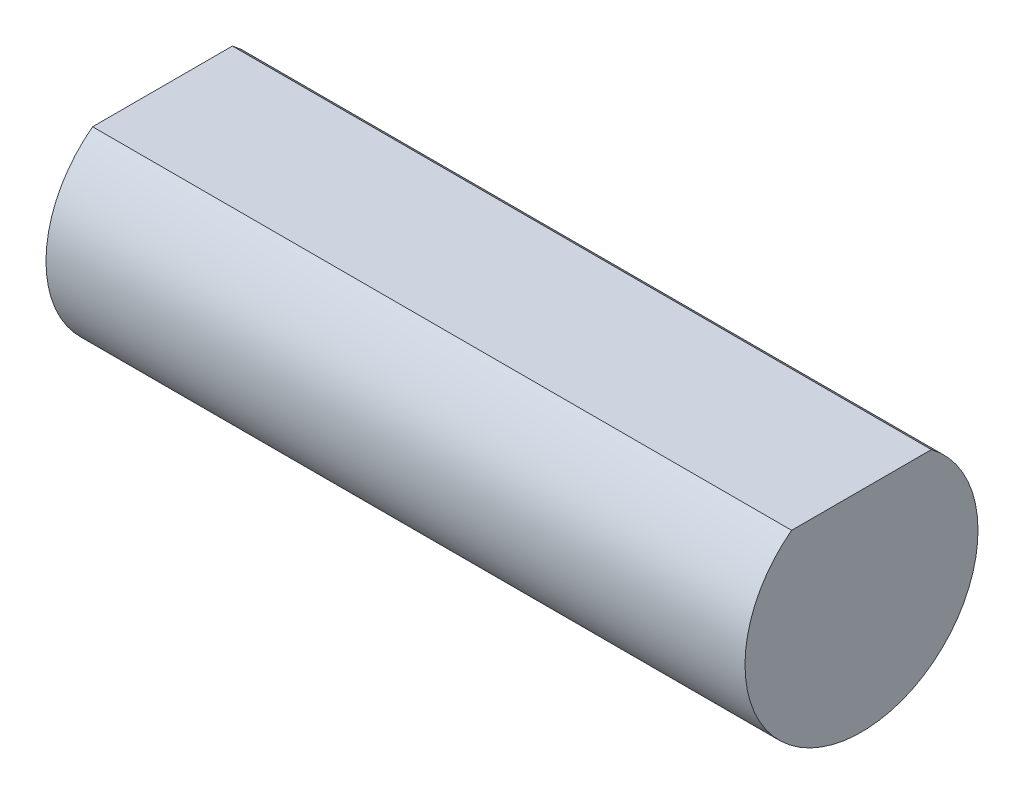
ISO-10303-21;
HEADER;
FILE_DESCRIPTION(('STEP AP214'),'2;1');
FILE_NAME('part.step','',(''),(''),'','','');
FILE_SCHEMA(('AUTOMOTIVE_DESIGN { 1 0 10303 214 1 1 1 1 }'));
ENDSEC;
DATA;
#1=APPLICATION_CONTEXT('core data for automotive mechanical design processes');
#2=APPLICATION_PROTOCOL_DEFINITION('international standard','automotive_design',2000,#1);
#3=PRODUCT_CONTEXT('',#1,'mechanical');
#4=PRODUCT('Part','Part','',(#3));
#5=PRODUCT_RELATED_PRODUCT_CATEGORY('part','',(#4));
#6=PRODUCT_DEFINITION_FORMATION('','',#4);
#7=PRODUCT_DEFINITION_CONTEXT('part definition',#1,'design');
#8=PRODUCT_DEFINITION('design','',#6,#7);
#9=PRODUCT_DEFINITION_SHAPE('','',#8);
#10=(LENGTH_UNIT() NAMED_UNIT(*) SI_UNIT(.MILLI.,.METRE.));
#11=(NAMED_UNIT(*) PLANE_ANGLE_UNIT() SI_UNIT($,.RADIAN.));
#12=(NAMED_UNIT(*) SI_UNIT($,.STERADIAN.) SOLID_ANGLE_UNIT());
#13=UNCERTAINTY_MEASURE_WITH_UNIT(LENGTH_MEASURE(1.E-05),#10,'distance_accuracy_value','');
#14=(GEOMETRIC_REPRESENTATION_CONTEXT(3) GLOBAL_UNCERTAINTY_ASSIGNED_CONTEXT((#13)) GLOBAL_UNIT_ASSIGNED_CONTEXT((#10,
#11,#12)) REPRESENTATION_CONTEXT('',''));
#15=CARTESIAN_POINT('',(0.,0.,0.));
#16=DIRECTION('',(0.,0.,1.));
#17=DIRECTION('',(1.,0.,0.));
#18=AXIS2_PLACEMENT_3D('',#15,#16,#17);
#19=CARTESIAN_POINT('',(19.05,2.54,0.));
#20=DIRECTION('',(0.,1.,0.));
#21=DIRECTION('',(0.,0.,1.));
#22=AXIS2_PLACEMENT_3D('',#19,#20,#21);
#23=PLANE('',#22);
#24=DIRECTION('',(0.,0.,-1.));
#25=VECTOR('',#24,1.);
#26=CARTESIAN_POINT('',(0.,2.54,0.));
#27=LINE('',#26,#25);
#28=CARTESIAN_POINT('',(0.,2.54,1.905));
#29=VERTEX_POINT('',#28);
#30=CARTESIAN_POINT('',(0.,2.54,-1.905));
#31=VERTEX_POINT('',#30);
#32=EDGE_CURVE('E61',#29,#31,#27,.T.);
#33=ORIENTED_EDGE('',*,*,#32,.F.);
#34=DIRECTION('',(-1.,0.,0.));
#35=VECTOR('',#34,1.);
#36=CARTESIAN_POINT('',(19.05,2.54,1.905));
#37=LINE('',#36,#35);
#38=CARTESIAN_POINT('',(19.05,2.54,1.905));
#39=VERTEX_POINT('',#38);
#40=EDGE_CURVE('E11',#39,#29,#37,.T.);
#41=ORIENTED_EDGE('',*,*,#40,.F.);
#42=DIRECTION('',(0.,0.,-1.));
#43=VECTOR('',#42,1.);
#44=CARTESIAN_POINT('',(19.05,2.54,0.));
#45=LINE('',#44,#43);
#46=CARTESIAN_POINT('',(19.05,2.54,-1.905));
#47=VERTEX_POINT('',#46);
#48=EDGE_CURVE('E62',#39,#47,#45,.T.);
#49=ORIENTED_EDGE('',*,*,#48,.T.);
#50=DIRECTION('',(-1.,0.,0.));
#51=VECTOR('',#50,1.);
#52=CARTESIAN_POINT('',(19.05,2.54,-1.905));
#53=LINE('',#52,#51);
#54=EDGE_CURVE('E41',#47,#31,#53,.T.);
#55=ORIENTED_EDGE('',*,*,#54,.T.);
#56=EDGE_LOOP('',(#33,#41,#49,#55));
#57=FACE_BOUND('',#56,.T.);
#58=ADVANCED_FACE('F33',(#57),#23,.T.);
#59=CARTESIAN_POINT('',(19.05,0.,0.));
#60=DIRECTION('',(-1.,0.,0.));
#61=DIRECTION('',(0.,0.,1.));
#62=AXIS2_PLACEMENT_3D('',#59,#60,#61);
#63=CYLINDRICAL_SURFACE('',#62,3.175);
#64=CARTESIAN_POINT('',(0.,0.,0.));
#65=DIRECTION('',(1.,0.,0.));
#66=DIRECTION('',(0.,0.,-1.));
#67=AXIS2_PLACEMENT_3D('',#64,#65,#66);
#68=CIRCLE('',#67,3.175);
#69=EDGE_CURVE('E63',#29,#31,#68,.T.);
#70=ORIENTED_EDGE('',*,*,#69,.T.);
#71=ORIENTED_EDGE('',*,*,#54,.F.);
#72=CARTESIAN_POINT('',(19.05,0.,0.));
#73=DIRECTION('',(1.,0.,0.));
#74=DIRECTION('',(0.,0.,-1.));
#75=AXIS2_PLACEMENT_3D('',#72,#73,#74);
#76=CIRCLE('',#75,3.175);
#77=EDGE_CURVE('E48',#39,#47,#76,.T.);
#78=ORIENTED_EDGE('',*,*,#77,.F.);
#79=ORIENTED_EDGE('',*,*,#40,.T.);
#80=EDGE_LOOP('',(#70,#71,#78,#79));
#81=FACE_BOUND('',#80,.T.);
#82=ADVANCED_FACE('F64',(#81),#63,.T.);
#83=CARTESIAN_POINT('',(19.05,0.,0.));
#84=DIRECTION('',(1.,0.,0.));
#85=DIRECTION('',(0.,0.,-1.));
#86=AXIS2_PLACEMENT_3D('',#83,#84,#85);
#87=PLANE('',#86);
#88=ORIENTED_EDGE('',*,*,#48,.F.);
#89=ORIENTED_EDGE('',*,*,#77,.T.);
#90=EDGE_LOOP('',(#88,#89));
#91=FACE_BOUND('',#90,.T.);
#92=ADVANCED_FACE('F72',(#91),#87,.T.);
#93=CARTESIAN_POINT('',(0.,0.,0.));
#94=DIRECTION('',(1.,0.,0.));
#95=DIRECTION('',(0.,0.,-1.));
#96=AXIS2_PLACEMENT_3D('',#93,#94,#95);
#97=PLANE('',#96);
#98=ORIENTED_EDGE('',*,*,#32,.T.);
#99=ORIENTED_EDGE('',*,*,#69,.F.);
#100=EDGE_LOOP('',(#98,#99));
#101=FACE_BOUND('',#100,.T.);
#102=ADVANCED_FACE('F67',(#101),#97,.F.);
#103=CLOSED_SHELL('',(#58,#82,#92,#102));
#104=MANIFOLD_SOLID_BREP('B2',#103);
#105=ADVANCED_BREP_SHAPE_REPRESENTATION('',(#18,#104),#14);
#106=SHAPE_DEFINITION_REPRESENTATION(#9,#105);
ENDSEC;
END-ISO-10303-21;
